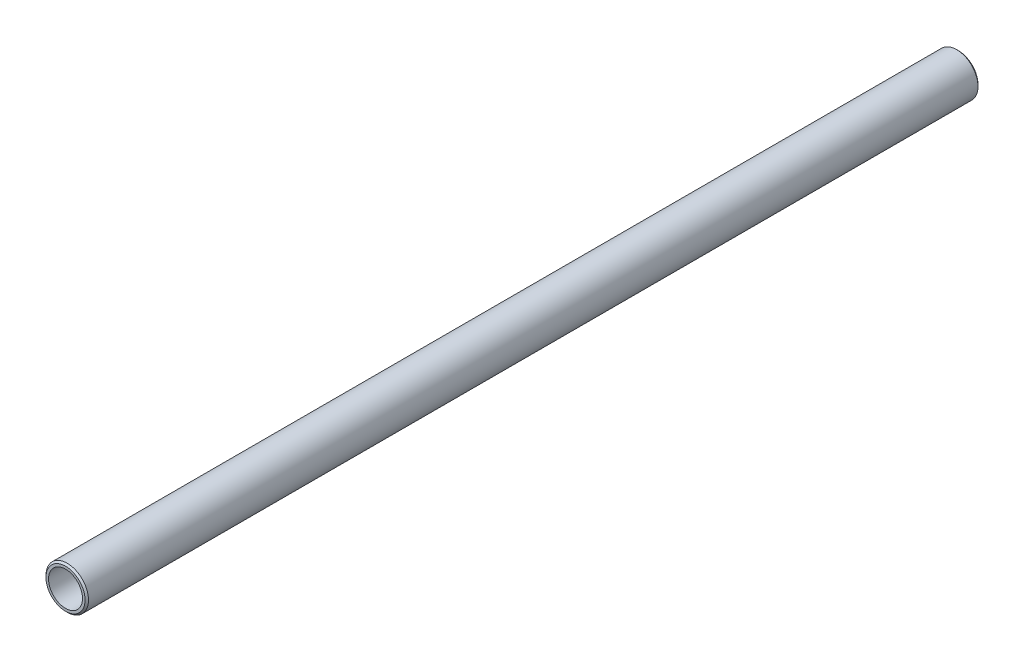
ISO-10303-21;
HEADER;
FILE_DESCRIPTION(('STEP AP214'),'2;1');
FILE_NAME('part.step','',(''),(''),'','','');
FILE_SCHEMA(('AUTOMOTIVE_DESIGN { 1 0 10303 214 1 1 1 1 }'));
ENDSEC;
DATA;
#1=APPLICATION_CONTEXT('core data for automotive mechanical design processes');
#2=APPLICATION_PROTOCOL_DEFINITION('international standard','automotive_design',2000,#1);
#3=PRODUCT_CONTEXT('',#1,'mechanical');
#4=PRODUCT('Part','Part','',(#3));
#5=PRODUCT_RELATED_PRODUCT_CATEGORY('part','',(#4));
#6=PRODUCT_DEFINITION_FORMATION('','',#4);
#7=PRODUCT_DEFINITION_CONTEXT('part definition',#1,'design');
#8=PRODUCT_DEFINITION('design','',#6,#7);
#9=PRODUCT_DEFINITION_SHAPE('','',#8);
#10=(LENGTH_UNIT() NAMED_UNIT(*) SI_UNIT(.MILLI.,.METRE.));
#11=(NAMED_UNIT(*) PLANE_ANGLE_UNIT() SI_UNIT($,.RADIAN.));
#12=(NAMED_UNIT(*) SI_UNIT($,.STERADIAN.) SOLID_ANGLE_UNIT());
#13=UNCERTAINTY_MEASURE_WITH_UNIT(LENGTH_MEASURE(1.E-05),#10,'distance_accuracy_value','');
#14=(GEOMETRIC_REPRESENTATION_CONTEXT(3) GLOBAL_UNCERTAINTY_ASSIGNED_CONTEXT((#13)) GLOBAL_UNIT_ASSIGNED_CONTEXT((#10,
#11,#12)) REPRESENTATION_CONTEXT('',''));
#15=CARTESIAN_POINT('',(0.,0.,0.));
#16=DIRECTION('',(0.,0.,1.));
#17=DIRECTION('',(1.,0.,0.));
#18=AXIS2_PLACEMENT_3D('',#15,#16,#17);
#19=CARTESIAN_POINT('',(0.,0.,210.));
#20=DIRECTION('',(0.,0.,1.));
#21=DIRECTION('',(1.,0.,0.));
#22=AXIS2_PLACEMENT_3D('',#19,#20,#21);
#23=PLANE('',#22);
#24=CARTESIAN_POINT('',(0.,0.,210.));
#25=DIRECTION('',(0.,0.,1.));
#26=DIRECTION('',(1.,0.,0.));
#27=AXIS2_PLACEMENT_3D('',#24,#25,#26);
#28=CIRCLE('',#27,4.59999999999999);
#29=CARTESIAN_POINT('',(4.59999999999999,0.,210.));
#30=VERTEX_POINT('',#29);
#31=EDGE_CURVE('E10',#30,#30,#28,.T.);
#32=ORIENTED_EDGE('',*,*,#31,.T.);
#33=EDGE_LOOP('',(#32));
#34=FACE_BOUND('',#33,.T.);
#35=CARTESIAN_POINT('',(0.,0.,210.));
#36=DIRECTION('',(0.,0.,1.));
#37=DIRECTION('',(1.,0.,0.));
#38=AXIS2_PLACEMENT_3D('',#35,#36,#37);
#39=CIRCLE('',#38,4.);
#40=CARTESIAN_POINT('',(4.,0.,210.));
#41=VERTEX_POINT('',#40);
#42=EDGE_CURVE('E60',#41,#41,#39,.T.);
#43=ORIENTED_EDGE('',*,*,#42,.F.);
#44=EDGE_LOOP('',(#43));
#45=FACE_BOUND('',#44,.T.);
#46=ADVANCED_FACE('F39',(#34,#45),#23,.T.);
#47=CARTESIAN_POINT('',(0.,0.,0.));
#48=DIRECTION('',(0.,0.,1.));
#49=DIRECTION('',(1.,0.,0.));
#50=AXIS2_PLACEMENT_3D('',#47,#48,#49);
#51=PLANE('',#50);
#52=CARTESIAN_POINT('',(0.,0.,0.));
#53=DIRECTION('',(0.,0.,1.));
#54=DIRECTION('',(1.,0.,0.));
#55=AXIS2_PLACEMENT_3D('',#52,#53,#54);
#56=CIRCLE('',#55,4.60000000000002);
#57=CARTESIAN_POINT('',(4.60000000000002,0.,0.));
#58=VERTEX_POINT('',#57);
#59=EDGE_CURVE('E47',#58,#58,#56,.F.);
#60=ORIENTED_EDGE('',*,*,#59,.T.);
#61=EDGE_LOOP('',(#60));
#62=FACE_BOUND('',#61,.T.);
#63=CARTESIAN_POINT('',(0.,0.,0.));
#64=DIRECTION('',(0.,0.,1.));
#65=DIRECTION('',(1.,0.,0.));
#66=AXIS2_PLACEMENT_3D('',#63,#64,#65);
#67=CIRCLE('',#66,4.);
#68=CARTESIAN_POINT('',(4.,0.,0.));
#69=VERTEX_POINT('',#68);
#70=EDGE_CURVE('E61',#69,#69,#67,.T.);
#71=ORIENTED_EDGE('',*,*,#70,.T.);
#72=EDGE_LOOP('',(#71));
#73=FACE_BOUND('',#72,.T.);
#74=ADVANCED_FACE('F71',(#62,#73),#51,.F.);
#75=CARTESIAN_POINT('',(0.,0.,210.));
#76=DIRECTION('',(0.,0.,-1.));
#77=DIRECTION('',(-1.,0.,0.));
#78=AXIS2_PLACEMENT_3D('',#75,#76,#77);
#79=CYLINDRICAL_SURFACE('',#78,5.);
#80=CARTESIAN_POINT('',(0.,0.,0.400000000000011));
#81=DIRECTION('',(0.,0.,1.));
#82=DIRECTION('',(1.,0.,0.));
#83=AXIS2_PLACEMENT_3D('',#80,#81,#82);
#84=CIRCLE('',#83,5.);
#85=CARTESIAN_POINT('',(5.,0.,0.400000000000011));
#86=VERTEX_POINT('',#85);
#87=EDGE_CURVE('E51',#86,#86,#84,.T.);
#88=ORIENTED_EDGE('',*,*,#87,.T.);
#89=EDGE_LOOP('',(#88));
#90=FACE_BOUND('',#89,.T.);
#91=CARTESIAN_POINT('',(0.,0.,209.6));
#92=DIRECTION('',(0.,0.,1.));
#93=DIRECTION('',(1.,0.,0.));
#94=AXIS2_PLACEMENT_3D('',#91,#92,#93);
#95=CIRCLE('',#94,5.);
#96=CARTESIAN_POINT('',(5.,0.,209.6));
#97=VERTEX_POINT('',#96);
#98=EDGE_CURVE('E55',#97,#97,#95,.F.);
#99=ORIENTED_EDGE('',*,*,#98,.T.);
#100=EDGE_LOOP('',(#99));
#101=FACE_BOUND('',#100,.T.);
#102=ADVANCED_FACE('F77',(#90,#101),#79,.T.);
#103=CARTESIAN_POINT('',(0.,0.,210.));
#104=DIRECTION('',(0.,0.,-1.));
#105=DIRECTION('',(-1.,0.,0.));
#106=AXIS2_PLACEMENT_3D('',#103,#104,#105);
#107=CYLINDRICAL_SURFACE('',#106,4.);
#108=ORIENTED_EDGE('',*,*,#42,.T.);
#109=EDGE_LOOP('',(#108));
#110=FACE_BOUND('',#109,.T.);
#111=ORIENTED_EDGE('',*,*,#70,.F.);
#112=EDGE_LOOP('',(#111));
#113=FACE_BOUND('',#112,.T.);
#114=ADVANCED_FACE('F67',(#110,#113),#107,.F.);
#115=CARTESIAN_POINT('',(0.,0.,0.400000000000011));
#116=DIRECTION('',(0.,0.,1.));
#117=DIRECTION('',(1.,0.,0.));
#118=AXIS2_PLACEMENT_3D('',#115,#116,#117);
#119=CONICAL_SURFACE('',#118,5.,0.785398163397408);
#120=ORIENTED_EDGE('',*,*,#59,.F.);
#121=EDGE_LOOP('',(#120));
#122=FACE_BOUND('',#121,.T.);
#123=ORIENTED_EDGE('',*,*,#87,.F.);
#124=EDGE_LOOP('',(#123));
#125=FACE_BOUND('',#124,.T.);
#126=ADVANCED_FACE('F84',(#122,#125),#119,.T.);
#127=CARTESIAN_POINT('',(0.,0.,210.));
#128=DIRECTION('',(0.,0.,-1.));
#129=DIRECTION('',(-1.,0.,0.));
#130=AXIS2_PLACEMENT_3D('',#127,#128,#129);
#131=CONICAL_SURFACE('',#130,4.59999999999999,0.785398163397443);
#132=ORIENTED_EDGE('',*,*,#98,.F.);
#133=EDGE_LOOP('',(#132));
#134=FACE_BOUND('',#133,.T.);
#135=ORIENTED_EDGE('',*,*,#31,.F.);
#136=EDGE_LOOP('',(#135));
#137=FACE_BOUND('',#136,.T.);
#138=ADVANCED_FACE('F42',(#134,#137),#131,.T.);
#139=CLOSED_SHELL('',(#46,#74,#102,#114,#126,#138));
#140=MANIFOLD_SOLID_BREP('B2',#139);
#141=ADVANCED_BREP_SHAPE_REPRESENTATION('',(#18,#140),#14);
#142=SHAPE_DEFINITION_REPRESENTATION(#9,#141);
ENDSEC;
END-ISO-10303-21;
